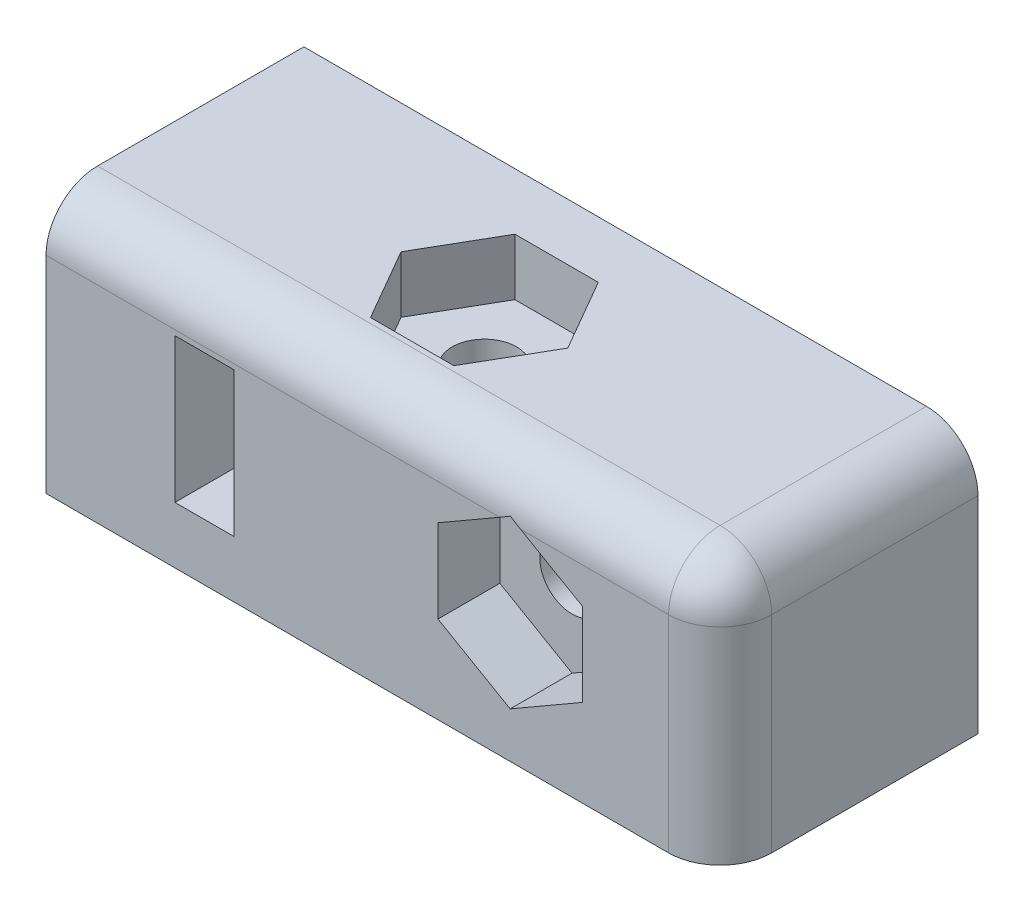
ISO-10303-21;
HEADER;
FILE_DESCRIPTION(('STEP AP214'),'2;1');
FILE_NAME('part.step','',(''),(''),'','','');
FILE_SCHEMA(('AUTOMOTIVE_DESIGN { 1 0 10303 214 1 1 1 1 }'));
ENDSEC;
DATA;
#1=APPLICATION_CONTEXT('core data for automotive mechanical design processes');
#2=APPLICATION_PROTOCOL_DEFINITION('international standard','automotive_design',2000,#1);
#3=PRODUCT_CONTEXT('',#1,'mechanical');
#4=PRODUCT('Part','Part','',(#3));
#5=PRODUCT_RELATED_PRODUCT_CATEGORY('part','',(#4));
#6=PRODUCT_DEFINITION_FORMATION('','',#4);
#7=PRODUCT_DEFINITION_CONTEXT('part definition',#1,'design');
#8=PRODUCT_DEFINITION('design','',#6,#7);
#9=PRODUCT_DEFINITION_SHAPE('','',#8);
#10=(LENGTH_UNIT() NAMED_UNIT(*) SI_UNIT(.MILLI.,.METRE.));
#11=(NAMED_UNIT(*) PLANE_ANGLE_UNIT() SI_UNIT($,.RADIAN.));
#12=(NAMED_UNIT(*) SI_UNIT($,.STERADIAN.) SOLID_ANGLE_UNIT());
#13=UNCERTAINTY_MEASURE_WITH_UNIT(LENGTH_MEASURE(1.E-05),#10,'distance_accuracy_value','');
#14=(GEOMETRIC_REPRESENTATION_CONTEXT(3) GLOBAL_UNCERTAINTY_ASSIGNED_CONTEXT((#13)) GLOBAL_UNIT_ASSIGNED_CONTEXT((#10,
#11,#12)) REPRESENTATION_CONTEXT('',''));
#15=CARTESIAN_POINT('',(0.,0.,0.));
#16=DIRECTION('',(0.,0.,1.));
#17=DIRECTION('',(1.,0.,0.));
#18=AXIS2_PLACEMENT_3D('',#15,#16,#17);
#19=CARTESIAN_POINT('',(18.,5.,0.));
#20=DIRECTION('',(0.,0.,-1.));
#21=DIRECTION('',(-1.,0.,0.));
#22=AXIS2_PLACEMENT_3D('',#19,#20,#21);
#23=CYLINDRICAL_SURFACE('',#22,1.25);
#24=CARTESIAN_POINT('',(18.,5.,-10.));
#25=DIRECTION('',(0.,0.,-1.));
#26=DIRECTION('',(-1.,0.,0.));
#27=AXIS2_PLACEMENT_3D('',#24,#25,#26);
#28=CIRCLE('',#27,1.25);
#29=CARTESIAN_POINT('',(16.75,5.,-10.));
#30=VERTEX_POINT('',#29);
#31=EDGE_CURVE('E342',#30,#30,#28,.T.);
#32=ORIENTED_EDGE('',*,*,#31,.T.);
#33=EDGE_LOOP('',(#32));
#34=FACE_BOUND('',#33,.T.);
#35=CARTESIAN_POINT('',(18.,5.,-2.4));
#36=DIRECTION('',(0.,0.,1.));
#37=DIRECTION('',(1.,0.,0.));
#38=AXIS2_PLACEMENT_3D('',#35,#36,#37);
#39=CIRCLE('',#38,1.25);
#40=CARTESIAN_POINT('',(19.25,5.,-2.4));
#41=VERTEX_POINT('',#40);
#42=EDGE_CURVE('E244',#41,#41,#39,.F.);
#43=ORIENTED_EDGE('',*,*,#42,.F.);
#44=EDGE_LOOP('',(#43));
#45=FACE_BOUND('',#44,.T.);
#46=ADVANCED_FACE('F34',(#34,#45),#23,.F.);
#47=CARTESIAN_POINT('',(12.,0.,-5.));
#48=DIRECTION('',(0.,1.,0.));
#49=DIRECTION('',(0.,0.,1.));
#50=AXIS2_PLACEMENT_3D('',#47,#48,#49);
#51=CYLINDRICAL_SURFACE('',#50,1.25);
#52=CARTESIAN_POINT('',(12.,0.,-5.));
#53=DIRECTION('',(0.,1.,0.));
#54=DIRECTION('',(0.,0.,1.));
#55=AXIS2_PLACEMENT_3D('',#52,#53,#54);
#56=CIRCLE('',#55,1.25);
#57=CARTESIAN_POINT('',(12.,0.,-3.75));
#58=VERTEX_POINT('',#57);
#59=EDGE_CURVE('E345',#58,#58,#56,.T.);
#60=ORIENTED_EDGE('',*,*,#59,.F.);
#61=EDGE_LOOP('',(#60));
#62=FACE_BOUND('',#61,.T.);
#63=CARTESIAN_POINT('',(12.,7.8,-5.));
#64=DIRECTION('',(0.,1.,0.));
#65=DIRECTION('',(0.,0.,1.));
#66=AXIS2_PLACEMENT_3D('',#63,#64,#65);
#67=CIRCLE('',#66,1.25);
#68=CARTESIAN_POINT('',(12.,7.8,-3.75));
#69=VERTEX_POINT('',#68);
#70=EDGE_CURVE('E328',#69,#69,#67,.F.);
#71=ORIENTED_EDGE('',*,*,#70,.F.);
#72=EDGE_LOOP('',(#71));
#73=FACE_BOUND('',#72,.T.);
#74=ADVANCED_FACE('F458',(#62,#73),#51,.F.);
#75=CARTESIAN_POINT('',(0.,10.,0.));
#76=DIRECTION('',(1.,0.,0.));
#77=DIRECTION('',(0.,0.,-1.));
#78=AXIS2_PLACEMENT_3D('',#75,#76,#77);
#79=PLANE('',#78);
#80=CARTESIAN_POINT('',(0.,5.,-5.));
#81=DIRECTION('',(-1.,0.,0.));
#82=DIRECTION('',(0.,0.,1.));
#83=AXIS2_PLACEMENT_3D('',#80,#81,#82);
#84=CIRCLE('',#83,1.25);
#85=CARTESIAN_POINT('',(0.,5.,-3.75));
#86=VERTEX_POINT('',#85);
#87=EDGE_CURVE('E339',#86,#86,#84,.T.);
#88=ORIENTED_EDGE('',*,*,#87,.F.);
#89=EDGE_LOOP('',(#88));
#90=FACE_BOUND('',#89,.T.);
#91=DIRECTION('',(0.,-1.,0.));
#92=VECTOR('',#91,1.);
#93=CARTESIAN_POINT('',(0.,10.,0.));
#94=LINE('',#93,#92);
#95=CARTESIAN_POINT('',(0.,8.,0.));
#96=VERTEX_POINT('',#95);
#97=CARTESIAN_POINT('',(0.,0.,0.));
#98=VERTEX_POINT('',#97);
#99=EDGE_CURVE('E364',#96,#98,#94,.T.);
#100=ORIENTED_EDGE('',*,*,#99,.F.);
#101=CARTESIAN_POINT('',(0.,8.,-2.));
#102=DIRECTION('',(1.,0.,0.));
#103=DIRECTION('',(0.,0.,-1.));
#104=AXIS2_PLACEMENT_3D('',#101,#102,#103);
#105=CIRCLE('',#104,2.);
#106=CARTESIAN_POINT('',(0.,10.,-2.));
#107=VERTEX_POINT('',#106);
#108=EDGE_CURVE('E393',#96,#107,#105,.F.);
#109=ORIENTED_EDGE('',*,*,#108,.T.);
#110=DIRECTION('',(0.,0.,1.));
#111=VECTOR('',#110,1.);
#112=CARTESIAN_POINT('',(0.,10.,0.));
#113=LINE('',#112,#111);
#114=CARTESIAN_POINT('',(0.,10.,-10.));
#115=VERTEX_POINT('',#114);
#116=EDGE_CURVE('E349',#115,#107,#113,.T.);
#117=ORIENTED_EDGE('',*,*,#116,.F.);
#118=DIRECTION('',(0.,-1.,0.));
#119=VECTOR('',#118,1.);
#120=CARTESIAN_POINT('',(0.,10.,-10.));
#121=LINE('',#120,#119);
#122=CARTESIAN_POINT('',(0.,0.,-10.));
#123=VERTEX_POINT('',#122);
#124=EDGE_CURVE('E355',#115,#123,#121,.T.);
#125=ORIENTED_EDGE('',*,*,#124,.T.);
#126=DIRECTION('',(0.,0.,1.));
#127=VECTOR('',#126,1.);
#128=CARTESIAN_POINT('',(0.,0.,0.));
#129=LINE('',#128,#127);
#130=EDGE_CURVE('E348',#123,#98,#129,.T.);
#131=ORIENTED_EDGE('',*,*,#130,.T.);
#132=EDGE_LOOP('',(#100,#109,#117,#125,#131));
#133=FACE_BOUND('',#132,.T.);
#134=ADVANCED_FACE('F419',(#90,#133),#79,.F.);
#135=CARTESIAN_POINT('',(0.,10.,0.));
#136=DIRECTION('',(0.,0.,-1.));
#137=DIRECTION('',(-1.,0.,0.));
#138=AXIS2_PLACEMENT_3D('',#135,#136,#137);
#139=PLANE('',#138);
#140=DIRECTION('',(0.,-1.,0.));
#141=VECTOR('',#140,1.);
#142=CARTESIAN_POINT('',(24.1415687353605,10.,0.));
#143=LINE('',#142,#141);
#144=CARTESIAN_POINT('',(24.1415687353605,0.,0.));
#145=VERTEX_POINT('',#144);
#146=CARTESIAN_POINT('',(24.1415687353605,8.,0.));
#147=VERTEX_POINT('',#146);
#148=EDGE_CURVE('E377',#145,#147,#143,.F.);
#149=ORIENTED_EDGE('',*,*,#148,.T.);
#150=DIRECTION('',(1.,0.,0.));
#151=VECTOR('',#150,1.);
#152=CARTESIAN_POINT('',(0.,8.,0.));
#153=LINE('',#152,#151);
#154=CARTESIAN_POINT('',(18.4038475772934,8.,0.));
#155=VERTEX_POINT('',#154);
#156=EDGE_CURVE('E387',#147,#155,#153,.F.);
#157=ORIENTED_EDGE('',*,*,#156,.T.);
#158=DIRECTION('',(-0.866025403784439,0.5,0.));
#159=VECTOR('',#158,1.);
#160=CARTESIAN_POINT('',(20.8,6.61658075373096,0.));
#161=LINE('',#160,#159);
#162=CARTESIAN_POINT('',(20.8,6.61658075373096,0.));
#163=VERTEX_POINT('',#162);
#164=EDGE_CURVE('E233',#163,#155,#161,.T.);
#165=ORIENTED_EDGE('',*,*,#164,.F.);
#166=DIRECTION('',(0.,1.,0.));
#167=VECTOR('',#166,1.);
#168=CARTESIAN_POINT('',(20.8,3.38341924626905,0.));
#169=LINE('',#168,#167);
#170=CARTESIAN_POINT('',(20.8,3.38341924626905,0.));
#171=VERTEX_POINT('',#170);
#172=EDGE_CURVE('E199',#171,#163,#169,.T.);
#173=ORIENTED_EDGE('',*,*,#172,.F.);
#174=DIRECTION('',(0.866025403784439,0.5,0.));
#175=VECTOR('',#174,1.);
#176=CARTESIAN_POINT('',(18.,1.7668384925381,0.));
#177=LINE('',#176,#175);
#178=CARTESIAN_POINT('',(18.,1.7668384925381,0.));
#179=VERTEX_POINT('',#178);
#180=EDGE_CURVE('E219',#179,#171,#177,.T.);
#181=ORIENTED_EDGE('',*,*,#180,.F.);
#182=DIRECTION('',(0.866025403784439,-0.5,0.));
#183=VECTOR('',#182,1.);
#184=CARTESIAN_POINT('',(15.2,3.38341924626905,0.));
#185=LINE('',#184,#183);
#186=CARTESIAN_POINT('',(15.2,3.38341924626905,0.));
#187=VERTEX_POINT('',#186);
#188=EDGE_CURVE('E222',#187,#179,#185,.T.);
#189=ORIENTED_EDGE('',*,*,#188,.F.);
#190=DIRECTION('',(0.,-1.,0.));
#191=VECTOR('',#190,1.);
#192=CARTESIAN_POINT('',(15.2,6.61658075373096,0.));
#193=LINE('',#192,#191);
#194=CARTESIAN_POINT('',(15.2,6.61658075373096,0.));
#195=VERTEX_POINT('',#194);
#196=EDGE_CURVE('E237',#195,#187,#193,.T.);
#197=ORIENTED_EDGE('',*,*,#196,.F.);
#198=DIRECTION('',(-0.866025403784438,-0.5,0.));
#199=VECTOR('',#198,1.);
#200=CARTESIAN_POINT('',(18.,8.23316150746191,0.));
#201=LINE('',#200,#199);
#202=CARTESIAN_POINT('',(17.5961524227066,8.,0.));
#203=VERTEX_POINT('',#202);
#204=EDGE_CURVE('E235',#203,#195,#201,.T.);
#205=ORIENTED_EDGE('',*,*,#204,.F.);
#206=DIRECTION('',(1.,0.,0.));
#207=VECTOR('',#206,1.);
#208=CARTESIAN_POINT('',(0.,8.,0.));
#209=LINE('',#208,#207);
#210=EDGE_CURVE('E385',#203,#96,#209,.F.);
#211=ORIENTED_EDGE('',*,*,#210,.T.);
#212=ORIENTED_EDGE('',*,*,#99,.T.);
#213=DIRECTION('',(1.,0.,0.));
#214=VECTOR('',#213,1.);
#215=CARTESIAN_POINT('',(0.,0.,0.));
#216=LINE('',#215,#214);
#217=EDGE_CURVE('E358',#98,#145,#216,.T.);
#218=ORIENTED_EDGE('',*,*,#217,.T.);
#219=EDGE_LOOP('',(#149,#157,#165,#173,#181,#189,#197,#205,#211,#212,#218));
#220=FACE_BOUND('',#219,.T.);
#221=DIRECTION('',(-1.,0.,0.));
#222=VECTOR('',#221,1.);
#223=CARTESIAN_POINT('',(5.,7.8,0.));
#224=LINE('',#223,#222);
#225=CARTESIAN_POINT('',(7.3,7.8,0.));
#226=VERTEX_POINT('',#225);
#227=CARTESIAN_POINT('',(5.,7.8,0.));
#228=VERTEX_POINT('',#227);
#229=EDGE_CURVE('E271',#226,#228,#224,.T.);
#230=ORIENTED_EDGE('',*,*,#229,.F.);
#231=DIRECTION('',(0.,1.,0.));
#232=VECTOR('',#231,1.);
#233=CARTESIAN_POINT('',(7.3,2.2,0.));
#234=LINE('',#233,#232);
#235=CARTESIAN_POINT('',(7.3,2.2,0.));
#236=VERTEX_POINT('',#235);
#237=EDGE_CURVE('E255',#236,#226,#234,.T.);
#238=ORIENTED_EDGE('',*,*,#237,.F.);
#239=DIRECTION('',(1.,0.,0.));
#240=VECTOR('',#239,1.);
#241=CARTESIAN_POINT('',(5.,2.2,0.));
#242=LINE('',#241,#240);
#243=CARTESIAN_POINT('',(5.,2.2,0.));
#244=VERTEX_POINT('',#243);
#245=EDGE_CURVE('E260',#244,#236,#242,.T.);
#246=ORIENTED_EDGE('',*,*,#245,.F.);
#247=DIRECTION('',(0.,-1.,0.));
#248=VECTOR('',#247,1.);
#249=CARTESIAN_POINT('',(5.,2.2,0.));
#250=LINE('',#249,#248);
#251=EDGE_CURVE('E274',#228,#244,#250,.T.);
#252=ORIENTED_EDGE('',*,*,#251,.F.);
#253=EDGE_LOOP('',(#230,#238,#246,#252));
#254=FACE_BOUND('',#253,.T.);
#255=ADVANCED_FACE('F423',(#220,#254),#139,.F.);
#256=CARTESIAN_POINT('',(0.,10.,-10.));
#257=DIRECTION('',(0.,0.,1.));
#258=DIRECTION('',(1.,0.,0.));
#259=AXIS2_PLACEMENT_3D('',#256,#257,#258);
#260=PLANE('',#259);
#261=ORIENTED_EDGE('',*,*,#31,.F.);
#262=EDGE_LOOP('',(#261));
#263=FACE_BOUND('',#262,.T.);
#264=DIRECTION('',(-1.,0.,0.));
#265=VECTOR('',#264,1.);
#266=CARTESIAN_POINT('',(0.,10.,-10.));
#267=LINE('',#266,#265);
#268=CARTESIAN_POINT('',(24.1415687353605,10.,-10.));
#269=VERTEX_POINT('',#268);
#270=EDGE_CURVE('E352',#269,#115,#267,.T.);
#271=ORIENTED_EDGE('',*,*,#270,.F.);
#272=CARTESIAN_POINT('',(24.1415687353605,8.,-10.));
#273=DIRECTION('',(0.,0.,1.));
#274=DIRECTION('',(1.,0.,0.));
#275=AXIS2_PLACEMENT_3D('',#272,#273,#274);
#276=CIRCLE('',#275,2.);
#277=CARTESIAN_POINT('',(26.1415687353605,8.,-10.));
#278=VERTEX_POINT('',#277);
#279=EDGE_CURVE('E43',#269,#278,#276,.F.);
#280=ORIENTED_EDGE('',*,*,#279,.T.);
#281=DIRECTION('',(0.,-1.,0.));
#282=VECTOR('',#281,1.);
#283=CARTESIAN_POINT('',(26.1415687353605,10.,-10.));
#284=LINE('',#283,#282);
#285=CARTESIAN_POINT('',(26.1415687353605,0.,-10.));
#286=VERTEX_POINT('',#285);
#287=EDGE_CURVE('E253',#278,#286,#284,.T.);
#288=ORIENTED_EDGE('',*,*,#287,.T.);
#289=DIRECTION('',(-1.,0.,0.));
#290=VECTOR('',#289,1.);
#291=CARTESIAN_POINT('',(0.,0.,-10.));
#292=LINE('',#291,#290);
#293=EDGE_CURVE('E353',#286,#123,#292,.T.);
#294=ORIENTED_EDGE('',*,*,#293,.T.);
#295=ORIENTED_EDGE('',*,*,#124,.F.);
#296=EDGE_LOOP('',(#271,#280,#288,#294,#295));
#297=FACE_BOUND('',#296,.T.);
#298=ADVANCED_FACE('F473',(#263,#297),#260,.F.);
#299=CARTESIAN_POINT('',(0.,10.,0.));
#300=DIRECTION('',(0.,-1.,0.));
#301=DIRECTION('',(0.,0.,-1.));
#302=AXIS2_PLACEMENT_3D('',#299,#300,#301);
#303=PLANE('',#302);
#304=DIRECTION('',(0.5,0.,-0.866025403784439));
#305=VECTOR('',#304,1.);
#306=CARTESIAN_POINT('',(13.616580753731,10.,-2.2));
#307=LINE('',#306,#305);
#308=CARTESIAN_POINT('',(13.616580753731,10.,-2.2));
#309=VERTEX_POINT('',#308);
#310=CARTESIAN_POINT('',(15.2331615074619,10.,-5.));
#311=VERTEX_POINT('',#310);
#312=EDGE_CURVE('E312',#309,#311,#307,.T.);
#313=ORIENTED_EDGE('',*,*,#312,.F.);
#314=DIRECTION('',(1.,0.,0.));
#315=VECTOR('',#314,1.);
#316=CARTESIAN_POINT('',(10.383419246269,10.,-2.2));
#317=LINE('',#316,#315);
#318=CARTESIAN_POINT('',(10.383419246269,10.,-2.2));
#319=VERTEX_POINT('',#318);
#320=EDGE_CURVE('E290',#319,#309,#317,.T.);
#321=ORIENTED_EDGE('',*,*,#320,.F.);
#322=DIRECTION('',(0.5,0.,0.866025403784439));
#323=VECTOR('',#322,1.);
#324=CARTESIAN_POINT('',(8.7668384925381,10.,-5.));
#325=LINE('',#324,#323);
#326=CARTESIAN_POINT('',(8.7668384925381,10.,-5.));
#327=VERTEX_POINT('',#326);
#328=EDGE_CURVE('E295',#327,#319,#325,.T.);
#329=ORIENTED_EDGE('',*,*,#328,.F.);
#330=DIRECTION('',(-0.5,0.,0.866025403784439));
#331=VECTOR('',#330,1.);
#332=CARTESIAN_POINT('',(10.383419246269,10.,-7.8));
#333=LINE('',#332,#331);
#334=CARTESIAN_POINT('',(10.383419246269,10.,-7.8));
#335=VERTEX_POINT('',#334);
#336=EDGE_CURVE('E321',#335,#327,#333,.T.);
#337=ORIENTED_EDGE('',*,*,#336,.F.);
#338=DIRECTION('',(-1.,0.,0.));
#339=VECTOR('',#338,1.);
#340=CARTESIAN_POINT('',(13.616580753731,10.,-7.8));
#341=LINE('',#340,#339);
#342=CARTESIAN_POINT('',(13.616580753731,10.,-7.8));
#343=VERTEX_POINT('',#342);
#344=EDGE_CURVE('E318',#343,#335,#341,.T.);
#345=ORIENTED_EDGE('',*,*,#344,.F.);
#346=DIRECTION('',(-0.5,0.,-0.866025403784439));
#347=VECTOR('',#346,1.);
#348=CARTESIAN_POINT('',(15.2331615074619,10.,-5.));
#349=LINE('',#348,#347);
#350=EDGE_CURVE('E315',#311,#343,#349,.T.);
#351=ORIENTED_EDGE('',*,*,#350,.F.);
#352=EDGE_LOOP('',(#313,#321,#329,#337,#345,#351));
#353=FACE_BOUND('',#352,.T.);
#354=ORIENTED_EDGE('',*,*,#116,.T.);
#355=DIRECTION('',(1.,0.,0.));
#356=VECTOR('',#355,1.);
#357=CARTESIAN_POINT('',(0.,10.,-2.));
#358=LINE('',#357,#356);
#359=CARTESIAN_POINT('',(24.1415687353605,10.,-2.));
#360=VERTEX_POINT('',#359);
#361=EDGE_CURVE('E382',#107,#360,#358,.T.);
#362=ORIENTED_EDGE('',*,*,#361,.T.);
#363=DIRECTION('',(0.,0.,-1.));
#364=VECTOR('',#363,1.);
#365=CARTESIAN_POINT('',(24.1415687353605,10.,0.));
#366=LINE('',#365,#364);
#367=EDGE_CURVE('E380',#360,#269,#366,.T.);
#368=ORIENTED_EDGE('',*,*,#367,.T.);
#369=ORIENTED_EDGE('',*,*,#270,.T.);
#370=EDGE_LOOP('',(#354,#362,#368,#369));
#371=FACE_BOUND('',#370,.T.);
#372=ADVANCED_FACE('F410',(#353,#371),#303,.F.);
#373=CARTESIAN_POINT('',(0.,0.,0.));
#374=DIRECTION('',(0.,-1.,0.));
#375=DIRECTION('',(0.,0.,-1.));
#376=AXIS2_PLACEMENT_3D('',#373,#374,#375);
#377=PLANE('',#376);
#378=DIRECTION('',(0.,0.,-1.));
#379=VECTOR('',#378,1.);
#380=CARTESIAN_POINT('',(26.1415687353605,0.,0.));
#381=LINE('',#380,#379);
#382=CARTESIAN_POINT('',(26.1415687353605,0.,-2.));
#383=VERTEX_POINT('',#382);
#384=EDGE_CURVE('E366',#383,#286,#381,.T.);
#385=ORIENTED_EDGE('',*,*,#384,.F.);
#386=CARTESIAN_POINT('',(24.1415687353605,0.,-2.));
#387=DIRECTION('',(0.,-1.,0.));
#388=DIRECTION('',(0.,0.,-1.));
#389=AXIS2_PLACEMENT_3D('',#386,#387,#388);
#390=CIRCLE('',#389,2.);
#391=EDGE_CURVE('E375',#383,#145,#390,.T.);
#392=ORIENTED_EDGE('',*,*,#391,.T.);
#393=ORIENTED_EDGE('',*,*,#217,.F.);
#394=ORIENTED_EDGE('',*,*,#130,.F.);
#395=ORIENTED_EDGE('',*,*,#293,.F.);
#396=EDGE_LOOP('',(#385,#392,#393,#394,#395));
#397=FACE_BOUND('',#396,.T.);
#398=ORIENTED_EDGE('',*,*,#59,.T.);
#399=EDGE_LOOP('',(#398));
#400=FACE_BOUND('',#399,.T.);
#401=ADVANCED_FACE('F429',(#397,#400),#377,.T.);
#402=CARTESIAN_POINT('',(5.,5.,-5.));
#403=DIRECTION('',(-1.,0.,0.));
#404=DIRECTION('',(0.,0.,1.));
#405=AXIS2_PLACEMENT_3D('',#402,#403,#404);
#406=CYLINDRICAL_SURFACE('',#405,1.25);
#407=CARTESIAN_POINT('',(5.,5.,-5.));
#408=DIRECTION('',(-1.,0.,0.));
#409=DIRECTION('',(0.,0.,1.));
#410=AXIS2_PLACEMENT_3D('',#407,#408,#409);
#411=CIRCLE('',#410,1.25);
#412=CARTESIAN_POINT('',(5.,5.,-3.75));
#413=VERTEX_POINT('',#412);
#414=EDGE_CURVE('E281',#413,#413,#411,.F.);
#415=ORIENTED_EDGE('',*,*,#414,.T.);
#416=EDGE_LOOP('',(#415));
#417=FACE_BOUND('',#416,.T.);
#418=ORIENTED_EDGE('',*,*,#87,.T.);
#419=EDGE_LOOP('',(#418));
#420=FACE_BOUND('',#419,.T.);
#421=ADVANCED_FACE('F468',(#417,#420),#406,.F.);
#422=CARTESIAN_POINT('',(0.,7.8,0.));
#423=DIRECTION('',(0.,1.,0.));
#424=DIRECTION('',(0.,0.,1.));
#425=AXIS2_PLACEMENT_3D('',#422,#423,#424);
#426=PLANE('',#425);
#427=DIRECTION('',(1.,0.,0.));
#428=VECTOR('',#427,1.);
#429=CARTESIAN_POINT('',(10.383419246269,7.8,-2.2));
#430=LINE('',#429,#428);
#431=CARTESIAN_POINT('',(10.383419246269,7.8,-2.2));
#432=VERTEX_POINT('',#431);
#433=CARTESIAN_POINT('',(13.616580753731,7.8,-2.2));
#434=VERTEX_POINT('',#433);
#435=EDGE_CURVE('E291',#432,#434,#430,.T.);
#436=ORIENTED_EDGE('',*,*,#435,.T.);
#437=DIRECTION('',(0.5,0.,-0.866025403784439));
#438=VECTOR('',#437,1.);
#439=CARTESIAN_POINT('',(13.616580753731,7.8,-2.2));
#440=LINE('',#439,#438);
#441=CARTESIAN_POINT('',(15.2331615074619,7.8,-5.));
#442=VERTEX_POINT('',#441);
#443=EDGE_CURVE('E294',#434,#442,#440,.T.);
#444=ORIENTED_EDGE('',*,*,#443,.T.);
#445=DIRECTION('',(-0.5,0.,-0.866025403784439));
#446=VECTOR('',#445,1.);
#447=CARTESIAN_POINT('',(15.2331615074619,7.8,-5.));
#448=LINE('',#447,#446);
#449=CARTESIAN_POINT('',(13.616580753731,7.8,-7.8));
#450=VERTEX_POINT('',#449);
#451=EDGE_CURVE('E298',#442,#450,#448,.T.);
#452=ORIENTED_EDGE('',*,*,#451,.T.);
#453=DIRECTION('',(-1.,0.,0.));
#454=VECTOR('',#453,1.);
#455=CARTESIAN_POINT('',(13.616580753731,7.8,-7.8));
#456=LINE('',#455,#454);
#457=CARTESIAN_POINT('',(10.383419246269,7.8,-7.8));
#458=VERTEX_POINT('',#457);
#459=EDGE_CURVE('E301',#450,#458,#456,.T.);
#460=ORIENTED_EDGE('',*,*,#459,.T.);
#461=DIRECTION('',(-0.5,0.,0.866025403784439));
#462=VECTOR('',#461,1.);
#463=CARTESIAN_POINT('',(10.383419246269,7.8,-7.8));
#464=LINE('',#463,#462);
#465=CARTESIAN_POINT('',(8.7668384925381,7.8,-5.));
#466=VERTEX_POINT('',#465);
#467=EDGE_CURVE('E304',#458,#466,#464,.T.);
#468=ORIENTED_EDGE('',*,*,#467,.T.);
#469=DIRECTION('',(0.5,0.,0.866025403784439));
#470=VECTOR('',#469,1.);
#471=CARTESIAN_POINT('',(8.7668384925381,7.8,-5.));
#472=LINE('',#471,#470);
#473=EDGE_CURVE('E307',#466,#432,#472,.T.);
#474=ORIENTED_EDGE('',*,*,#473,.T.);
#475=EDGE_LOOP('',(#436,#444,#452,#460,#468,#474));
#476=FACE_BOUND('',#475,.T.);
#477=ORIENTED_EDGE('',*,*,#70,.T.);
#478=EDGE_LOOP('',(#477));
#479=FACE_BOUND('',#478,.T.);
#480=ADVANCED_FACE('F656',(#476,#479),#426,.T.);
#481=CARTESIAN_POINT('',(10.383419246269,7.8,-2.2));
#482=DIRECTION('',(0.,0.,1.));
#483=DIRECTION('',(1.,0.,0.));
#484=AXIS2_PLACEMENT_3D('',#481,#482,#483);
#485=PLANE('',#484);
#486=ORIENTED_EDGE('',*,*,#320,.T.);
#487=DIRECTION('',(0.,1.,0.));
#488=VECTOR('',#487,1.);
#489=CARTESIAN_POINT('',(13.616580753731,7.8,-2.2));
#490=LINE('',#489,#488);
#491=EDGE_CURVE('E310',#434,#309,#490,.T.);
#492=ORIENTED_EDGE('',*,*,#491,.F.);
#493=ORIENTED_EDGE('',*,*,#435,.F.);
#494=DIRECTION('',(0.,1.,0.));
#495=VECTOR('',#494,1.);
#496=CARTESIAN_POINT('',(10.383419246269,7.8,-2.2));
#497=LINE('',#496,#495);
#498=EDGE_CURVE('E326',#432,#319,#497,.T.);
#499=ORIENTED_EDGE('',*,*,#498,.T.);
#500=EDGE_LOOP('',(#486,#492,#493,#499));
#501=FACE_BOUND('',#500,.T.);
#502=ADVANCED_FACE('F646',(#501),#485,.F.);
#503=CARTESIAN_POINT('',(8.7668384925381,7.8,-5.));
#504=DIRECTION('',(-0.866025403784439,0.,0.5));
#505=DIRECTION('',(0.5,0.,0.866025403784439));
#506=AXIS2_PLACEMENT_3D('',#503,#504,#505);
#507=PLANE('',#506);
#508=ORIENTED_EDGE('',*,*,#328,.T.);
#509=ORIENTED_EDGE('',*,*,#498,.F.);
#510=ORIENTED_EDGE('',*,*,#473,.F.);
#511=DIRECTION('',(0.,1.,0.));
#512=VECTOR('',#511,1.);
#513=CARTESIAN_POINT('',(8.7668384925381,7.8,-5.));
#514=LINE('',#513,#512);
#515=EDGE_CURVE('E329',#466,#327,#514,.T.);
#516=ORIENTED_EDGE('',*,*,#515,.T.);
#517=EDGE_LOOP('',(#508,#509,#510,#516));
#518=FACE_BOUND('',#517,.T.);
#519=ADVANCED_FACE('F636',(#518),#507,.F.);
#520=CARTESIAN_POINT('',(10.383419246269,7.8,-7.8));
#521=DIRECTION('',(-0.866025403784439,0.,-0.5));
#522=DIRECTION('',(-0.5,0.,0.866025403784439));
#523=AXIS2_PLACEMENT_3D('',#520,#521,#522);
#524=PLANE('',#523);
#525=ORIENTED_EDGE('',*,*,#336,.T.);
#526=ORIENTED_EDGE('',*,*,#515,.F.);
#527=ORIENTED_EDGE('',*,*,#467,.F.);
#528=DIRECTION('',(0.,1.,0.));
#529=VECTOR('',#528,1.);
#530=CARTESIAN_POINT('',(10.383419246269,7.8,-7.8));
#531=LINE('',#530,#529);
#532=EDGE_CURVE('E331',#458,#335,#531,.T.);
#533=ORIENTED_EDGE('',*,*,#532,.T.);
#534=EDGE_LOOP('',(#525,#526,#527,#533));
#535=FACE_BOUND('',#534,.T.);
#536=ADVANCED_FACE('F626',(#535),#524,.F.);
#537=CARTESIAN_POINT('',(13.616580753731,7.8,-7.8));
#538=DIRECTION('',(0.,0.,-1.));
#539=DIRECTION('',(-1.,0.,0.));
#540=AXIS2_PLACEMENT_3D('',#537,#538,#539);
#541=PLANE('',#540);
#542=ORIENTED_EDGE('',*,*,#344,.T.);
#543=ORIENTED_EDGE('',*,*,#532,.F.);
#544=ORIENTED_EDGE('',*,*,#459,.F.);
#545=DIRECTION('',(0.,1.,0.));
#546=VECTOR('',#545,1.);
#547=CARTESIAN_POINT('',(13.616580753731,7.8,-7.8));
#548=LINE('',#547,#546);
#549=EDGE_CURVE('E333',#450,#343,#548,.T.);
#550=ORIENTED_EDGE('',*,*,#549,.T.);
#551=EDGE_LOOP('',(#542,#543,#544,#550));
#552=FACE_BOUND('',#551,.T.);
#553=ADVANCED_FACE('F616',(#552),#541,.F.);
#554=CARTESIAN_POINT('',(15.2331615074619,7.8,-5.));
#555=DIRECTION('',(0.866025403784439,0.,-0.5));
#556=DIRECTION('',(-0.5,0.,-0.866025403784439));
#557=AXIS2_PLACEMENT_3D('',#554,#555,#556);
#558=PLANE('',#557);
#559=ORIENTED_EDGE('',*,*,#350,.T.);
#560=ORIENTED_EDGE('',*,*,#549,.F.);
#561=ORIENTED_EDGE('',*,*,#451,.F.);
#562=DIRECTION('',(0.,1.,0.));
#563=VECTOR('',#562,1.);
#564=CARTESIAN_POINT('',(15.2331615074619,7.8,-5.));
#565=LINE('',#564,#563);
#566=EDGE_CURVE('E335',#442,#311,#565,.T.);
#567=ORIENTED_EDGE('',*,*,#566,.T.);
#568=EDGE_LOOP('',(#559,#560,#561,#567));
#569=FACE_BOUND('',#568,.T.);
#570=ADVANCED_FACE('F606',(#569),#558,.F.);
#571=CARTESIAN_POINT('',(13.616580753731,7.8,-2.2));
#572=DIRECTION('',(0.866025403784439,0.,0.5));
#573=DIRECTION('',(0.5,0.,-0.866025403784439));
#574=AXIS2_PLACEMENT_3D('',#571,#572,#573);
#575=PLANE('',#574);
#576=ORIENTED_EDGE('',*,*,#312,.T.);
#577=ORIENTED_EDGE('',*,*,#566,.F.);
#578=ORIENTED_EDGE('',*,*,#443,.F.);
#579=ORIENTED_EDGE('',*,*,#491,.T.);
#580=EDGE_LOOP('',(#576,#577,#578,#579));
#581=FACE_BOUND('',#580,.T.);
#582=ADVANCED_FACE('F596',(#581),#575,.F.);
#583=CARTESIAN_POINT('',(5.,2.2,-7.3));
#584=DIRECTION('',(-1.,0.,0.));
#585=DIRECTION('',(0.,0.,1.));
#586=AXIS2_PLACEMENT_3D('',#583,#584,#585);
#587=PLANE('',#586);
#588=ORIENTED_EDGE('',*,*,#251,.T.);
#589=DIRECTION('',(0.,0.,1.));
#590=VECTOR('',#589,1.);
#591=CARTESIAN_POINT('',(5.,2.2,-7.3));
#592=LINE('',#591,#590);
#593=CARTESIAN_POINT('',(5.,2.2,-7.3));
#594=VERTEX_POINT('',#593);
#595=EDGE_CURVE('E282',#594,#244,#592,.T.);
#596=ORIENTED_EDGE('',*,*,#595,.F.);
#597=DIRECTION('',(0.,-1.,0.));
#598=VECTOR('',#597,1.);
#599=CARTESIAN_POINT('',(5.,2.2,-7.3));
#600=LINE('',#599,#598);
#601=CARTESIAN_POINT('',(5.,7.8,-7.3));
#602=VERTEX_POINT('',#601);
#603=EDGE_CURVE('E263',#602,#594,#600,.T.);
#604=ORIENTED_EDGE('',*,*,#603,.F.);
#605=DIRECTION('',(0.,0.,1.));
#606=VECTOR('',#605,1.);
#607=CARTESIAN_POINT('',(5.,7.8,-7.3));
#608=LINE('',#607,#606);
#609=EDGE_CURVE('E284',#602,#228,#608,.T.);
#610=ORIENTED_EDGE('',*,*,#609,.T.);
#611=EDGE_LOOP('',(#588,#596,#604,#610));
#612=FACE_BOUND('',#611,.T.);
#613=ORIENTED_EDGE('',*,*,#414,.F.);
#614=EDGE_LOOP('',(#613));
#615=FACE_BOUND('',#614,.T.);
#616=ADVANCED_FACE('F586',(#612,#615),#587,.F.);
#617=CARTESIAN_POINT('',(7.3,2.2,-7.3));
#618=DIRECTION('',(1.,0.,0.));
#619=DIRECTION('',(0.,0.,-1.));
#620=AXIS2_PLACEMENT_3D('',#617,#618,#619);
#621=PLANE('',#620);
#622=ORIENTED_EDGE('',*,*,#237,.T.);
#623=DIRECTION('',(0.,0.,1.));
#624=VECTOR('',#623,1.);
#625=CARTESIAN_POINT('',(7.3,7.8,-7.3));
#626=LINE('',#625,#624);
#627=CARTESIAN_POINT('',(7.3,7.8,-7.3));
#628=VERTEX_POINT('',#627);
#629=EDGE_CURVE('E269',#628,#226,#626,.T.);
#630=ORIENTED_EDGE('',*,*,#629,.F.);
#631=DIRECTION('',(0.,1.,0.));
#632=VECTOR('',#631,1.);
#633=CARTESIAN_POINT('',(7.3,2.2,-7.3));
#634=LINE('',#633,#632);
#635=CARTESIAN_POINT('',(7.3,2.2,-7.3));
#636=VERTEX_POINT('',#635);
#637=EDGE_CURVE('E256',#636,#628,#634,.T.);
#638=ORIENTED_EDGE('',*,*,#637,.F.);
#639=DIRECTION('',(0.,0.,1.));
#640=VECTOR('',#639,1.);
#641=CARTESIAN_POINT('',(7.3,2.2,-7.3));
#642=LINE('',#641,#640);
#643=EDGE_CURVE('E279',#636,#236,#642,.T.);
#644=ORIENTED_EDGE('',*,*,#643,.T.);
#645=EDGE_LOOP('',(#622,#630,#638,#644));
#646=FACE_BOUND('',#645,.T.);
#647=ADVANCED_FACE('F576',(#646),#621,.F.);
#648=CARTESIAN_POINT('',(5.,2.2,-7.3));
#649=DIRECTION('',(0.,-1.,0.));
#650=DIRECTION('',(0.,0.,-1.));
#651=AXIS2_PLACEMENT_3D('',#648,#649,#650);
#652=PLANE('',#651);
#653=ORIENTED_EDGE('',*,*,#245,.T.);
#654=ORIENTED_EDGE('',*,*,#643,.F.);
#655=DIRECTION('',(1.,0.,0.));
#656=VECTOR('',#655,1.);
#657=CARTESIAN_POINT('',(5.,2.2,-7.3));
#658=LINE('',#657,#656);
#659=EDGE_CURVE('E266',#594,#636,#658,.T.);
#660=ORIENTED_EDGE('',*,*,#659,.F.);
#661=ORIENTED_EDGE('',*,*,#595,.T.);
#662=EDGE_LOOP('',(#653,#654,#660,#661));
#663=FACE_BOUND('',#662,.T.);
#664=ADVANCED_FACE('F566',(#663),#652,.F.);
#665=CARTESIAN_POINT('',(5.,7.8,-7.3));
#666=DIRECTION('',(0.,1.,0.));
#667=DIRECTION('',(0.,0.,1.));
#668=AXIS2_PLACEMENT_3D('',#665,#666,#667);
#669=PLANE('',#668);
#670=ORIENTED_EDGE('',*,*,#229,.T.);
#671=ORIENTED_EDGE('',*,*,#609,.F.);
#672=DIRECTION('',(-1.,0.,0.));
#673=VECTOR('',#672,1.);
#674=CARTESIAN_POINT('',(5.,7.8,-7.3));
#675=LINE('',#674,#673);
#676=EDGE_CURVE('E259',#628,#602,#675,.T.);
#677=ORIENTED_EDGE('',*,*,#676,.F.);
#678=ORIENTED_EDGE('',*,*,#629,.T.);
#679=EDGE_LOOP('',(#670,#671,#677,#678));
#680=FACE_BOUND('',#679,.T.);
#681=ADVANCED_FACE('F556',(#680),#669,.F.);
#682=CARTESIAN_POINT('',(0.,0.,-7.3));
#683=DIRECTION('',(0.,0.,-1.));
#684=DIRECTION('',(-1.,0.,0.));
#685=AXIS2_PLACEMENT_3D('',#682,#683,#684);
#686=PLANE('',#685);
#687=ORIENTED_EDGE('',*,*,#637,.T.);
#688=ORIENTED_EDGE('',*,*,#676,.T.);
#689=ORIENTED_EDGE('',*,*,#603,.T.);
#690=ORIENTED_EDGE('',*,*,#659,.T.);
#691=EDGE_LOOP('',(#687,#688,#689,#690));
#692=FACE_BOUND('',#691,.T.);
#693=ADVANCED_FACE('F551',(#692),#686,.F.);
#694=CARTESIAN_POINT('',(26.1415687353605,29.7046994997844,-14.));
#695=DIRECTION('',(-1.,0.,0.));
#696=DIRECTION('',(0.,0.,1.));
#697=AXIS2_PLACEMENT_3D('',#694,#695,#696);
#698=PLANE('',#697);
#699=ORIENTED_EDGE('',*,*,#287,.F.);
#700=DIRECTION('',(0.,0.,-1.));
#701=VECTOR('',#700,1.);
#702=CARTESIAN_POINT('',(26.1415687353605,8.,-14.));
#703=LINE('',#702,#701);
#704=CARTESIAN_POINT('',(26.1415687353605,8.,-2.));
#705=VERTEX_POINT('',#704);
#706=EDGE_CURVE('E11',#278,#705,#703,.F.);
#707=ORIENTED_EDGE('',*,*,#706,.T.);
#708=DIRECTION('',(0.,-1.,0.));
#709=VECTOR('',#708,1.);
#710=CARTESIAN_POINT('',(26.1415687353605,29.7046994997844,-2.));
#711=LINE('',#710,#709);
#712=EDGE_CURVE('E371',#705,#383,#711,.T.);
#713=ORIENTED_EDGE('',*,*,#712,.T.);
#714=ORIENTED_EDGE('',*,*,#384,.T.);
#715=EDGE_LOOP('',(#699,#707,#713,#714));
#716=FACE_BOUND('',#715,.T.);
#717=ADVANCED_FACE('F540',(#716),#698,.F.);
#718=CARTESIAN_POINT('',(0.,0.,-2.4));
#719=DIRECTION('',(0.,0.,1.));
#720=DIRECTION('',(1.,0.,0.));
#721=AXIS2_PLACEMENT_3D('',#718,#719,#720);
#722=PLANE('',#721);
#723=DIRECTION('',(0.,1.,0.));
#724=VECTOR('',#723,1.);
#725=CARTESIAN_POINT('',(20.8,3.38341924626905,-2.4));
#726=LINE('',#725,#724);
#727=CARTESIAN_POINT('',(20.8,3.38341924626905,-2.4));
#728=VERTEX_POINT('',#727);
#729=CARTESIAN_POINT('',(20.8,6.61658075373096,-2.4));
#730=VERTEX_POINT('',#729);
#731=EDGE_CURVE('E196',#728,#730,#726,.T.);
#732=ORIENTED_EDGE('',*,*,#731,.T.);
#733=DIRECTION('',(-0.866025403784439,0.5,0.));
#734=VECTOR('',#733,1.);
#735=CARTESIAN_POINT('',(20.8,6.61658075373096,-2.4));
#736=LINE('',#735,#734);
#737=CARTESIAN_POINT('',(18.,8.23316150746191,-2.4));
#738=VERTEX_POINT('',#737);
#739=EDGE_CURVE('E207',#730,#738,#736,.T.);
#740=ORIENTED_EDGE('',*,*,#739,.T.);
#741=DIRECTION('',(-0.866025403784438,-0.5,0.));
#742=VECTOR('',#741,1.);
#743=CARTESIAN_POINT('',(18.,8.23316150746191,-2.4));
#744=LINE('',#743,#742);
#745=CARTESIAN_POINT('',(15.2,6.61658075373096,-2.4));
#746=VERTEX_POINT('',#745);
#747=EDGE_CURVE('E213',#738,#746,#744,.T.);
#748=ORIENTED_EDGE('',*,*,#747,.T.);
#749=DIRECTION('',(0.,-1.,0.));
#750=VECTOR('',#749,1.);
#751=CARTESIAN_POINT('',(15.2,6.61658075373096,-2.4));
#752=LINE('',#751,#750);
#753=CARTESIAN_POINT('',(15.2,3.38341924626905,-2.4));
#754=VERTEX_POINT('',#753);
#755=EDGE_CURVE('E226',#746,#754,#752,.T.);
#756=ORIENTED_EDGE('',*,*,#755,.T.);
#757=DIRECTION('',(0.866025403784439,-0.5,0.));
#758=VECTOR('',#757,1.);
#759=CARTESIAN_POINT('',(15.2,3.38341924626905,-2.4));
#760=LINE('',#759,#758);
#761=CARTESIAN_POINT('',(18.,1.7668384925381,-2.4));
#762=VERTEX_POINT('',#761);
#763=EDGE_CURVE('E229',#754,#762,#760,.T.);
#764=ORIENTED_EDGE('',*,*,#763,.T.);
#765=DIRECTION('',(0.866025403784439,0.5,0.));
#766=VECTOR('',#765,1.);
#767=CARTESIAN_POINT('',(18.,1.7668384925381,-2.4));
#768=LINE('',#767,#766);
#769=EDGE_CURVE('E204',#762,#728,#768,.T.);
#770=ORIENTED_EDGE('',*,*,#769,.T.);
#771=EDGE_LOOP('',(#732,#740,#748,#756,#764,#770));
#772=FACE_BOUND('',#771,.T.);
#773=ORIENTED_EDGE('',*,*,#42,.T.);
#774=EDGE_LOOP('',(#773));
#775=FACE_BOUND('',#774,.T.);
#776=ADVANCED_FACE('F215',(#772,#775),#722,.T.);
#777=CARTESIAN_POINT('',(20.8,3.38341924626905,-2.4));
#778=DIRECTION('',(1.,0.,0.));
#779=DIRECTION('',(0.,0.,-1.));
#780=AXIS2_PLACEMENT_3D('',#777,#778,#779);
#781=PLANE('',#780);
#782=ORIENTED_EDGE('',*,*,#172,.T.);
#783=DIRECTION('',(0.,0.,1.));
#784=VECTOR('',#783,1.);
#785=CARTESIAN_POINT('',(20.8,6.61658075373096,-2.4));
#786=LINE('',#785,#784);
#787=EDGE_CURVE('E192',#730,#163,#786,.T.);
#788=ORIENTED_EDGE('',*,*,#787,.F.);
#789=ORIENTED_EDGE('',*,*,#731,.F.);
#790=DIRECTION('',(0.,0.,1.));
#791=VECTOR('',#790,1.);
#792=CARTESIAN_POINT('',(20.8,3.38341924626905,-2.4));
#793=LINE('',#792,#791);
#794=EDGE_CURVE('E242',#728,#171,#793,.T.);
#795=ORIENTED_EDGE('',*,*,#794,.T.);
#796=EDGE_LOOP('',(#782,#788,#789,#795));
#797=FACE_BOUND('',#796,.T.);
#798=ADVANCED_FACE('F194',(#797),#781,.F.);
#799=CARTESIAN_POINT('',(18.,1.7668384925381,-2.4));
#800=DIRECTION('',(0.5,-0.866025403784439,0.));
#801=DIRECTION('',(0.866025403784439,0.5,0.));
#802=AXIS2_PLACEMENT_3D('',#799,#800,#801);
#803=PLANE('',#802);
#804=ORIENTED_EDGE('',*,*,#180,.T.);
#805=ORIENTED_EDGE('',*,*,#794,.F.);
#806=ORIENTED_EDGE('',*,*,#769,.F.);
#807=DIRECTION('',(0.,0.,1.));
#808=VECTOR('',#807,1.);
#809=CARTESIAN_POINT('',(18.,1.7668384925381,-2.4));
#810=LINE('',#809,#808);
#811=EDGE_CURVE('E245',#762,#179,#810,.T.);
#812=ORIENTED_EDGE('',*,*,#811,.T.);
#813=EDGE_LOOP('',(#804,#805,#806,#812));
#814=FACE_BOUND('',#813,.T.);
#815=ADVANCED_FACE('F447',(#814),#803,.F.);
#816=CARTESIAN_POINT('',(15.2,3.38341924626905,-2.4));
#817=DIRECTION('',(-0.5,-0.866025403784439,0.));
#818=DIRECTION('',(0.866025403784439,-0.5,0.));
#819=AXIS2_PLACEMENT_3D('',#816,#817,#818);
#820=PLANE('',#819);
#821=ORIENTED_EDGE('',*,*,#188,.T.);
#822=ORIENTED_EDGE('',*,*,#811,.F.);
#823=ORIENTED_EDGE('',*,*,#763,.F.);
#824=DIRECTION('',(0.,0.,1.));
#825=VECTOR('',#824,1.);
#826=CARTESIAN_POINT('',(15.2,3.38341924626905,-2.4));
#827=LINE('',#826,#825);
#828=EDGE_CURVE('E247',#754,#187,#827,.T.);
#829=ORIENTED_EDGE('',*,*,#828,.T.);
#830=EDGE_LOOP('',(#821,#822,#823,#829));
#831=FACE_BOUND('',#830,.T.);
#832=ADVANCED_FACE('F444',(#831),#820,.F.);
#833=CARTESIAN_POINT('',(15.2,6.61658075373096,-2.4));
#834=DIRECTION('',(-1.,0.,0.));
#835=DIRECTION('',(0.,-1.,0.));
#836=AXIS2_PLACEMENT_3D('',#833,#834,#835);
#837=PLANE('',#836);
#838=ORIENTED_EDGE('',*,*,#196,.T.);
#839=ORIENTED_EDGE('',*,*,#828,.F.);
#840=ORIENTED_EDGE('',*,*,#755,.F.);
#841=DIRECTION('',(0.,0.,1.));
#842=VECTOR('',#841,1.);
#843=CARTESIAN_POINT('',(15.2,6.61658075373096,-2.4));
#844=LINE('',#843,#842);
#845=EDGE_CURVE('E249',#746,#195,#844,.T.);
#846=ORIENTED_EDGE('',*,*,#845,.T.);
#847=EDGE_LOOP('',(#838,#839,#840,#846));
#848=FACE_BOUND('',#847,.T.);
#849=ADVANCED_FACE('F440',(#848),#837,.F.);
#850=CARTESIAN_POINT('',(18.,8.23316150746191,-2.4));
#851=DIRECTION('',(-0.5,0.866025403784438,0.));
#852=DIRECTION('',(-0.866025403784439,-0.5,0.));
#853=AXIS2_PLACEMENT_3D('',#850,#851,#852);
#854=PLANE('',#853);
#855=DIRECTION('',(0.,0.,1.));
#856=VECTOR('',#855,1.);
#857=CARTESIAN_POINT('',(18.,8.23316150746191,-2.4));
#858=LINE('',#857,#856);
#859=CARTESIAN_POINT('',(18.,8.23316150746191,-0.0136375679554122));
#860=VERTEX_POINT('',#859);
#861=EDGE_CURVE('E203',#738,#860,#858,.T.);
#862=ORIENTED_EDGE('',*,*,#861,.T.);
#863=CARTESIAN_POINT('',(17.5961524227066,8.,-2.));
#864=DIRECTION('',(-0.5,0.866025403784438,0.));
#865=DIRECTION('',(0.866025403784439,0.5,0.));
#866=AXIS2_PLACEMENT_3D('',#863,#864,#865);
#867=ELLIPSE('',#866,4.,2.);
#868=EDGE_CURVE('E391',#860,#203,#867,.F.);
#869=ORIENTED_EDGE('',*,*,#868,.T.);
#870=ORIENTED_EDGE('',*,*,#204,.T.);
#871=ORIENTED_EDGE('',*,*,#845,.F.);
#872=ORIENTED_EDGE('',*,*,#747,.F.);
#873=EDGE_LOOP('',(#862,#869,#870,#871,#872));
#874=FACE_BOUND('',#873,.T.);
#875=ADVANCED_FACE('F436',(#874),#854,.F.);
#876=CARTESIAN_POINT('',(20.8,6.61658075373096,-2.4));
#877=DIRECTION('',(0.5,0.866025403784439,0.));
#878=DIRECTION('',(-0.866025403784439,0.5,0.));
#879=AXIS2_PLACEMENT_3D('',#876,#877,#878);
#880=PLANE('',#879);
#881=ORIENTED_EDGE('',*,*,#164,.T.);
#882=CARTESIAN_POINT('',(18.4038475772934,8.,-2.));
#883=DIRECTION('',(0.5,0.866025403784439,0.));
#884=DIRECTION('',(0.866025403784439,-0.5,0.));
#885=AXIS2_PLACEMENT_3D('',#882,#883,#884);
#886=ELLIPSE('',#885,4.,2.);
#887=EDGE_CURVE('E389',#155,#860,#886,.F.);
#888=ORIENTED_EDGE('',*,*,#887,.T.);
#889=ORIENTED_EDGE('',*,*,#861,.F.);
#890=ORIENTED_EDGE('',*,*,#739,.F.);
#891=ORIENTED_EDGE('',*,*,#787,.T.);
#892=EDGE_LOOP('',(#881,#888,#889,#890,#891));
#893=FACE_BOUND('',#892,.T.);
#894=ADVANCED_FACE('F208',(#893),#880,.F.);
#895=CARTESIAN_POINT('',(24.1415687353605,29.7046994997844,-2.));
#896=DIRECTION('',(0.,-1.,0.));
#897=DIRECTION('',(0.,0.,-1.));
#898=AXIS2_PLACEMENT_3D('',#895,#896,#897);
#899=CYLINDRICAL_SURFACE('',#898,2.);
#900=ORIENTED_EDGE('',*,*,#712,.F.);
#901=CARTESIAN_POINT('',(24.1415687353605,8.,-2.));
#902=DIRECTION('',(0.,-1.,0.));
#903=DIRECTION('',(0.,0.,-1.));
#904=AXIS2_PLACEMENT_3D('',#901,#902,#903);
#905=CIRCLE('',#904,2.);
#906=EDGE_CURVE('E395',#705,#147,#905,.T.);
#907=ORIENTED_EDGE('',*,*,#906,.T.);
#908=ORIENTED_EDGE('',*,*,#148,.F.);
#909=ORIENTED_EDGE('',*,*,#391,.F.);
#910=EDGE_LOOP('',(#900,#907,#908,#909));
#911=FACE_BOUND('',#910,.T.);
#912=ADVANCED_FACE('F434',(#911),#899,.T.);
#913=CARTESIAN_POINT('',(24.1415687353605,8.,0.));
#914=DIRECTION('',(0.,0.,-1.));
#915=DIRECTION('',(-1.,0.,0.));
#916=AXIS2_PLACEMENT_3D('',#913,#914,#915);
#917=CYLINDRICAL_SURFACE('',#916,2.);
#918=CARTESIAN_POINT('',(24.1415687353605,8.,-2.));
#919=DIRECTION('',(0.,0.,1.));
#920=DIRECTION('',(1.,0.,0.));
#921=AXIS2_PLACEMENT_3D('',#918,#919,#920);
#922=CIRCLE('',#921,2.);
#923=EDGE_CURVE('E38',#705,#360,#922,.T.);
#924=ORIENTED_EDGE('',*,*,#923,.F.);
#925=ORIENTED_EDGE('',*,*,#706,.F.);
#926=ORIENTED_EDGE('',*,*,#279,.F.);
#927=ORIENTED_EDGE('',*,*,#367,.F.);
#928=EDGE_LOOP('',(#924,#925,#926,#927));
#929=FACE_BOUND('',#928,.T.);
#930=ADVANCED_FACE('F36',(#929),#917,.T.);
#931=CARTESIAN_POINT('',(24.1415687353605,8.,-2.));
#932=DIRECTION('',(0.,0.,1.));
#933=DIRECTION('',(1.,0.,0.));
#934=AXIS2_PLACEMENT_3D('',#931,#932,#933);
#935=SPHERICAL_SURFACE('',#934,2.);
#936=ORIENTED_EDGE('',*,*,#906,.F.);
#937=ORIENTED_EDGE('',*,*,#923,.T.);
#938=CARTESIAN_POINT('',(24.1415687353605,8.,-2.));
#939=DIRECTION('',(-1.,0.,0.));
#940=DIRECTION('',(0.,0.,1.));
#941=AXIS2_PLACEMENT_3D('',#938,#939,#940);
#942=CIRCLE('',#941,2.);
#943=EDGE_CURVE('E397',#147,#360,#942,.T.);
#944=ORIENTED_EDGE('',*,*,#943,.F.);
#945=EDGE_LOOP('',(#936,#937,#944));
#946=FACE_BOUND('',#945,.T.);
#947=ADVANCED_FACE('F407',(#946),#935,.T.);
#948=CARTESIAN_POINT('',(0.,8.,-2.));
#949=DIRECTION('',(1.,0.,0.));
#950=DIRECTION('',(0.,0.,-1.));
#951=AXIS2_PLACEMENT_3D('',#948,#949,#950);
#952=CYLINDRICAL_SURFACE('',#951,2.);
#953=ORIENTED_EDGE('',*,*,#887,.F.);
#954=ORIENTED_EDGE('',*,*,#156,.F.);
#955=ORIENTED_EDGE('',*,*,#943,.T.);
#956=ORIENTED_EDGE('',*,*,#361,.F.);
#957=ORIENTED_EDGE('',*,*,#108,.F.);
#958=ORIENTED_EDGE('',*,*,#210,.F.);
#959=ORIENTED_EDGE('',*,*,#868,.F.);
#960=EDGE_LOOP('',(#953,#954,#955,#956,#957,#958,#959));
#961=FACE_BOUND('',#960,.T.);
#962=ADVANCED_FACE('F414',(#961),#952,.T.);
#963=CLOSED_SHELL('',(#46,#74,#134,#255,#298,#372,#401,#421,#480,#502,#519,#536,#553,#570,#582,
#616,#647,#664,#681,#693,#717,#776,#798,#815,#832,#849,#875,#894,#912,#930,#947,#962));
#964=MANIFOLD_SOLID_BREP('B2',#963);
#965=ADVANCED_BREP_SHAPE_REPRESENTATION('',(#18,#964),#14);
#966=SHAPE_DEFINITION_REPRESENTATION(#9,#965);
ENDSEC;
END-ISO-10303-21;
